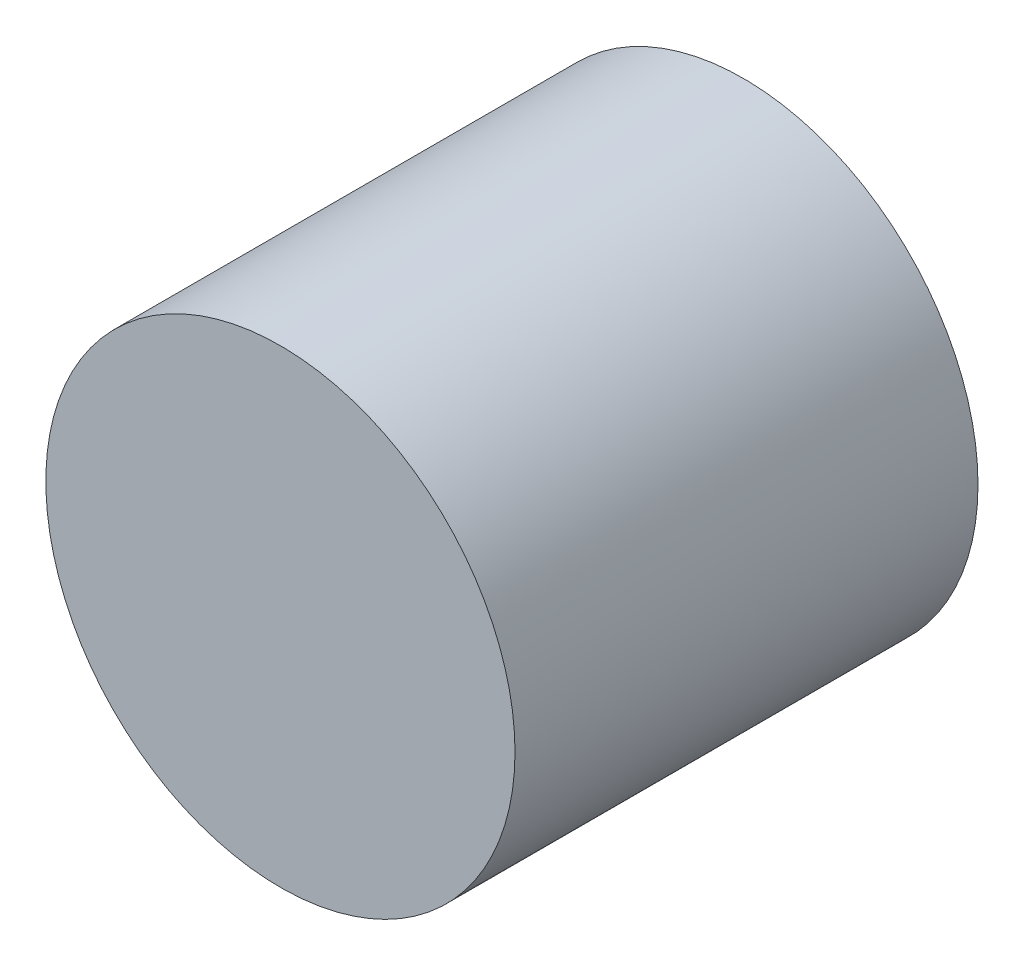
ISO-10303-21;
HEADER;
FILE_DESCRIPTION(('STEP AP214'),'2;1');
FILE_NAME('part.step','',(''),(''),'','','');
FILE_SCHEMA(('AUTOMOTIVE_DESIGN { 1 0 10303 214 1 1 1 1 }'));
ENDSEC;
DATA;
#1=APPLICATION_CONTEXT('core data for automotive mechanical design processes');
#2=APPLICATION_PROTOCOL_DEFINITION('international standard','automotive_design',2000,#1);
#3=PRODUCT_CONTEXT('',#1,'mechanical');
#4=PRODUCT('Part','Part','',(#3));
#5=PRODUCT_RELATED_PRODUCT_CATEGORY('part','',(#4));
#6=PRODUCT_DEFINITION_FORMATION('','',#4);
#7=PRODUCT_DEFINITION_CONTEXT('part definition',#1,'design');
#8=PRODUCT_DEFINITION('design','',#6,#7);
#9=PRODUCT_DEFINITION_SHAPE('','',#8);
#10=(LENGTH_UNIT() NAMED_UNIT(*) SI_UNIT(.MILLI.,.METRE.));
#11=(NAMED_UNIT(*) PLANE_ANGLE_UNIT() SI_UNIT($,.RADIAN.));
#12=(NAMED_UNIT(*) SI_UNIT($,.STERADIAN.) SOLID_ANGLE_UNIT());
#13=UNCERTAINTY_MEASURE_WITH_UNIT(LENGTH_MEASURE(1.E-05),#10,'distance_accuracy_value','');
#14=(GEOMETRIC_REPRESENTATION_CONTEXT(3) GLOBAL_UNCERTAINTY_ASSIGNED_CONTEXT((#13)) GLOBAL_UNIT_ASSIGNED_CONTEXT((#10,
#11,#12)) REPRESENTATION_CONTEXT('',''));
#15=CARTESIAN_POINT('',(0.,0.,0.));
#16=DIRECTION('',(0.,0.,1.));
#17=DIRECTION('',(1.,0.,0.));
#18=AXIS2_PLACEMENT_3D('',#15,#16,#17);
#19=CARTESIAN_POINT('',(-4.97633536173135,-25.8000000000002,-8.));
#20=DIRECTION('',(0.,0.,1.));
#21=DIRECTION('',(1.,0.,0.));
#22=AXIS2_PLACEMENT_3D('',#19,#20,#21);
#23=CYLINDRICAL_SURFACE('',#22,15.);
#24=CARTESIAN_POINT('',(-4.97633536173135,-25.8000000000002,-8.));
#25=DIRECTION('',(0.,0.,1.));
#26=DIRECTION('',(1.,0.,0.));
#27=AXIS2_PLACEMENT_3D('',#24,#25,#26);
#28=CIRCLE('',#27,15.);
#29=CARTESIAN_POINT('',(10.0236646382686,-25.8000000000002,-8.));
#30=VERTEX_POINT('',#29);
#31=EDGE_CURVE('E10',#30,#30,#28,.T.);
#32=ORIENTED_EDGE('',*,*,#31,.T.);
#33=EDGE_LOOP('',(#32));
#34=FACE_BOUND('',#33,.T.);
#35=CARTESIAN_POINT('',(-4.97633536173135,-25.8000000000002,21.6042043739771));
#36=DIRECTION('',(0.,0.,1.));
#37=DIRECTION('',(1.,0.,0.));
#38=AXIS2_PLACEMENT_3D('',#35,#36,#37);
#39=CIRCLE('',#38,15.);
#40=CARTESIAN_POINT('',(10.0236646382686,-25.8000000000002,21.6042043739771));
#41=VERTEX_POINT('',#40);
#42=EDGE_CURVE('E37',#41,#41,#39,.T.);
#43=ORIENTED_EDGE('',*,*,#42,.F.);
#44=EDGE_LOOP('',(#43));
#45=FACE_BOUND('',#44,.T.);
#46=ADVANCED_FACE('F31',(#34,#45),#23,.T.);
#47=CARTESIAN_POINT('',(-4.97633536173135,-25.8000000000002,-8.));
#48=DIRECTION('',(0.,0.,1.));
#49=DIRECTION('',(1.,0.,0.));
#50=AXIS2_PLACEMENT_3D('',#47,#48,#49);
#51=PLANE('',#50);
#52=ORIENTED_EDGE('',*,*,#31,.F.);
#53=EDGE_LOOP('',(#52));
#54=FACE_BOUND('',#53,.T.);
#55=ADVANCED_FACE('F46',(#54),#51,.F.);
#56=CARTESIAN_POINT('',(-4.97633536173135,-25.8000000000002,21.6042043739771));
#57=DIRECTION('',(0.,0.,1.));
#58=DIRECTION('',(1.,0.,0.));
#59=AXIS2_PLACEMENT_3D('',#56,#57,#58);
#60=PLANE('',#59);
#61=ORIENTED_EDGE('',*,*,#42,.T.);
#62=EDGE_LOOP('',(#61));
#63=FACE_BOUND('',#62,.T.);
#64=ADVANCED_FACE('F43',(#63),#60,.T.);
#65=CLOSED_SHELL('',(#46,#55,#64));
#66=MANIFOLD_SOLID_BREP('B2',#65);
#67=ADVANCED_BREP_SHAPE_REPRESENTATION('',(#18,#66),#14);
#68=SHAPE_DEFINITION_REPRESENTATION(#9,#67);
ENDSEC;
END-ISO-10303-21;
